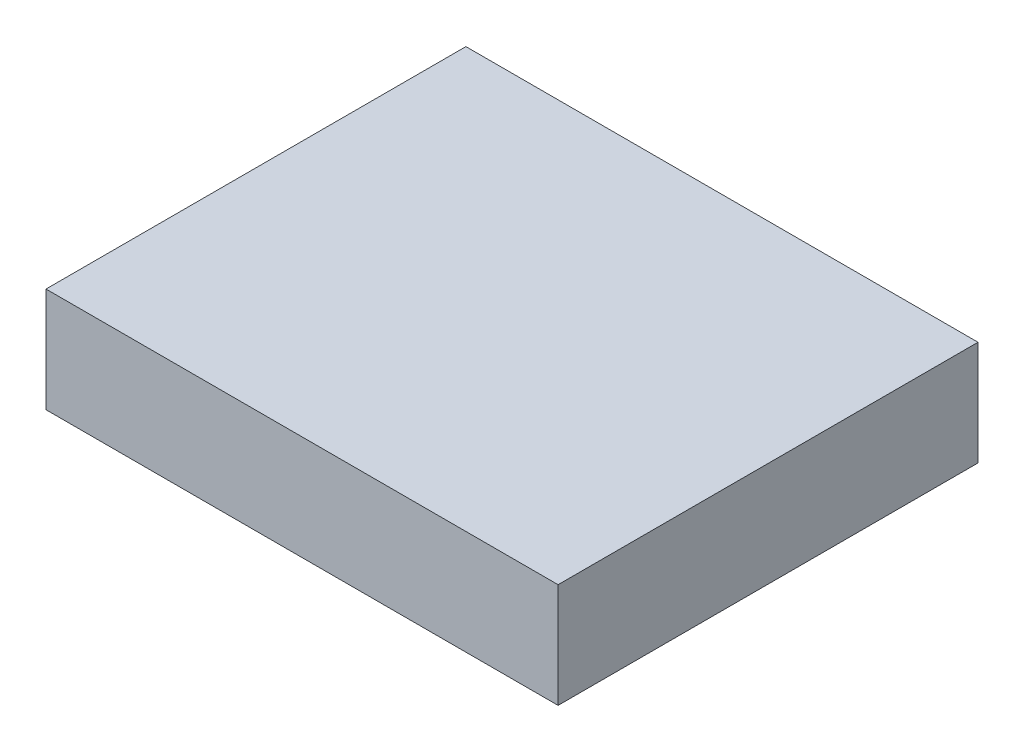
ISO-10303-21;
HEADER;
FILE_DESCRIPTION(('STEP AP214'),'2;1');
FILE_NAME('part.step','',(''),(''),'','','');
FILE_SCHEMA(('AUTOMOTIVE_DESIGN { 1 0 10303 214 1 1 1 1 }'));
ENDSEC;
DATA;
#1=APPLICATION_CONTEXT('core data for automotive mechanical design processes');
#2=APPLICATION_PROTOCOL_DEFINITION('international standard','automotive_design',2000,#1);
#3=PRODUCT_CONTEXT('',#1,'mechanical');
#4=PRODUCT('Part','Part','',(#3));
#5=PRODUCT_RELATED_PRODUCT_CATEGORY('part','',(#4));
#6=PRODUCT_DEFINITION_FORMATION('','',#4);
#7=PRODUCT_DEFINITION_CONTEXT('part definition',#1,'design');
#8=PRODUCT_DEFINITION('design','',#6,#7);
#9=PRODUCT_DEFINITION_SHAPE('','',#8);
#10=(LENGTH_UNIT() NAMED_UNIT(*) SI_UNIT(.MILLI.,.METRE.));
#11=(NAMED_UNIT(*) PLANE_ANGLE_UNIT() SI_UNIT($,.RADIAN.));
#12=(NAMED_UNIT(*) SI_UNIT($,.STERADIAN.) SOLID_ANGLE_UNIT());
#13=UNCERTAINTY_MEASURE_WITH_UNIT(LENGTH_MEASURE(1.E-05),#10,'distance_accuracy_value','');
#14=(GEOMETRIC_REPRESENTATION_CONTEXT(3) GLOBAL_UNCERTAINTY_ASSIGNED_CONTEXT((#13)) GLOBAL_UNIT_ASSIGNED_CONTEXT((#10,
#11,#12)) REPRESENTATION_CONTEXT('',''));
#15=CARTESIAN_POINT('',(0.,0.,0.));
#16=DIRECTION('',(0.,0.,1.));
#17=DIRECTION('',(1.,0.,0.));
#18=AXIS2_PLACEMENT_3D('',#15,#16,#17);
#19=CARTESIAN_POINT('',(0.,2.45,0.));
#20=DIRECTION('',(1.,0.,0.));
#21=DIRECTION('',(0.,0.,-1.));
#22=AXIS2_PLACEMENT_3D('',#19,#20,#21);
#23=PLANE('',#22);
#24=DIRECTION('',(0.,0.,1.));
#25=VECTOR('',#24,1.);
#26=CARTESIAN_POINT('',(0.,0.,0.));
#27=LINE('',#26,#25);
#28=CARTESIAN_POINT('',(0.,0.,-9.84));
#29=VERTEX_POINT('',#28);
#30=CARTESIAN_POINT('',(0.,0.,0.));
#31=VERTEX_POINT('',#30);
#32=EDGE_CURVE('E102',#29,#31,#27,.T.);
#33=ORIENTED_EDGE('',*,*,#32,.T.);
#34=DIRECTION('',(0.,-1.,0.));
#35=VECTOR('',#34,1.);
#36=CARTESIAN_POINT('',(0.,2.45,0.));
#37=LINE('',#36,#35);
#38=CARTESIAN_POINT('',(0.,2.45,0.));
#39=VERTEX_POINT('',#38);
#40=EDGE_CURVE('E11',#39,#31,#37,.T.);
#41=ORIENTED_EDGE('',*,*,#40,.F.);
#42=DIRECTION('',(0.,0.,1.));
#43=VECTOR('',#42,1.);
#44=CARTESIAN_POINT('',(0.,2.45,0.));
#45=LINE('',#44,#43);
#46=CARTESIAN_POINT('',(0.,2.45,-9.84));
#47=VERTEX_POINT('',#46);
#48=EDGE_CURVE('E90',#47,#39,#45,.T.);
#49=ORIENTED_EDGE('',*,*,#48,.F.);
#50=DIRECTION('',(0.,-1.,0.));
#51=VECTOR('',#50,1.);
#52=CARTESIAN_POINT('',(0.,2.45,-9.84));
#53=LINE('',#52,#51);
#54=EDGE_CURVE('E98',#47,#29,#53,.T.);
#55=ORIENTED_EDGE('',*,*,#54,.T.);
#56=EDGE_LOOP('',(#33,#41,#49,#55));
#57=FACE_BOUND('',#56,.T.);
#58=ADVANCED_FACE('F39',(#57),#23,.F.);
#59=CARTESIAN_POINT('',(0.,2.45,0.));
#60=DIRECTION('',(0.,0.,-1.));
#61=DIRECTION('',(-1.,0.,0.));
#62=AXIS2_PLACEMENT_3D('',#59,#60,#61);
#63=PLANE('',#62);
#64=DIRECTION('',(1.,0.,0.));
#65=VECTOR('',#64,1.);
#66=CARTESIAN_POINT('',(0.,0.,0.));
#67=LINE('',#66,#65);
#68=CARTESIAN_POINT('',(12.,0.,0.));
#69=VERTEX_POINT('',#68);
#70=EDGE_CURVE('E94',#31,#69,#67,.T.);
#71=ORIENTED_EDGE('',*,*,#70,.T.);
#72=DIRECTION('',(0.,-1.,0.));
#73=VECTOR('',#72,1.);
#74=CARTESIAN_POINT('',(12.,2.45,0.));
#75=LINE('',#74,#73);
#76=CARTESIAN_POINT('',(12.,2.45,0.));
#77=VERTEX_POINT('',#76);
#78=EDGE_CURVE('E47',#77,#69,#75,.T.);
#79=ORIENTED_EDGE('',*,*,#78,.F.);
#80=DIRECTION('',(1.,0.,0.));
#81=VECTOR('',#80,1.);
#82=CARTESIAN_POINT('',(0.,2.45,0.));
#83=LINE('',#82,#81);
#84=EDGE_CURVE('E85',#39,#77,#83,.T.);
#85=ORIENTED_EDGE('',*,*,#84,.F.);
#86=ORIENTED_EDGE('',*,*,#40,.T.);
#87=EDGE_LOOP('',(#71,#79,#85,#86));
#88=FACE_BOUND('',#87,.T.);
#89=ADVANCED_FACE('F93',(#88),#63,.F.);
#90=CARTESIAN_POINT('',(12.,2.45,0.));
#91=DIRECTION('',(-1.,0.,0.));
#92=DIRECTION('',(0.,0.,1.));
#93=AXIS2_PLACEMENT_3D('',#90,#91,#92);
#94=PLANE('',#93);
#95=DIRECTION('',(0.,0.,-1.));
#96=VECTOR('',#95,1.);
#97=CARTESIAN_POINT('',(12.,0.,0.));
#98=LINE('',#97,#96);
#99=CARTESIAN_POINT('',(12.,0.,-9.84));
#100=VERTEX_POINT('',#99);
#101=EDGE_CURVE('E72',#69,#100,#98,.T.);
#102=ORIENTED_EDGE('',*,*,#101,.T.);
#103=DIRECTION('',(0.,-1.,0.));
#104=VECTOR('',#103,1.);
#105=CARTESIAN_POINT('',(12.,2.45,-9.84));
#106=LINE('',#105,#104);
#107=CARTESIAN_POINT('',(12.,2.45,-9.84));
#108=VERTEX_POINT('',#107);
#109=EDGE_CURVE('E95',#108,#100,#106,.T.);
#110=ORIENTED_EDGE('',*,*,#109,.F.);
#111=DIRECTION('',(0.,0.,-1.));
#112=VECTOR('',#111,1.);
#113=CARTESIAN_POINT('',(12.,2.45,0.));
#114=LINE('',#113,#112);
#115=EDGE_CURVE('E88',#77,#108,#114,.T.);
#116=ORIENTED_EDGE('',*,*,#115,.F.);
#117=ORIENTED_EDGE('',*,*,#78,.T.);
#118=EDGE_LOOP('',(#102,#110,#116,#117));
#119=FACE_BOUND('',#118,.T.);
#120=ADVANCED_FACE('F96',(#119),#94,.F.);
#121=CARTESIAN_POINT('',(0.,2.45,-9.84));
#122=DIRECTION('',(0.,0.,1.));
#123=DIRECTION('',(1.,0.,0.));
#124=AXIS2_PLACEMENT_3D('',#121,#122,#123);
#125=PLANE('',#124);
#126=DIRECTION('',(-1.,0.,0.));
#127=VECTOR('',#126,1.);
#128=CARTESIAN_POINT('',(0.,0.,-9.84));
#129=LINE('',#128,#127);
#130=EDGE_CURVE('E78',#100,#29,#129,.T.);
#131=ORIENTED_EDGE('',*,*,#130,.T.);
#132=ORIENTED_EDGE('',*,*,#54,.F.);
#133=DIRECTION('',(-1.,0.,0.));
#134=VECTOR('',#133,1.);
#135=CARTESIAN_POINT('',(0.,2.45,-9.84));
#136=LINE('',#135,#134);
#137=EDGE_CURVE('E55',#108,#47,#136,.T.);
#138=ORIENTED_EDGE('',*,*,#137,.F.);
#139=ORIENTED_EDGE('',*,*,#109,.T.);
#140=EDGE_LOOP('',(#131,#132,#138,#139));
#141=FACE_BOUND('',#140,.T.);
#142=ADVANCED_FACE('F109',(#141),#125,.F.);
#143=CARTESIAN_POINT('',(0.,2.45,0.));
#144=DIRECTION('',(0.,-1.,0.));
#145=DIRECTION('',(0.,0.,-1.));
#146=AXIS2_PLACEMENT_3D('',#143,#144,#145);
#147=PLANE('',#146);
#148=ORIENTED_EDGE('',*,*,#48,.T.);
#149=ORIENTED_EDGE('',*,*,#84,.T.);
#150=ORIENTED_EDGE('',*,*,#115,.T.);
#151=ORIENTED_EDGE('',*,*,#137,.T.);
#152=EDGE_LOOP('',(#148,#149,#150,#151));
#153=FACE_BOUND('',#152,.T.);
#154=ADVANCED_FACE('F86',(#153),#147,.F.);
#155=CARTESIAN_POINT('',(0.,0.,0.));
#156=DIRECTION('',(0.,-1.,0.));
#157=DIRECTION('',(0.,0.,-1.));
#158=AXIS2_PLACEMENT_3D('',#155,#156,#157);
#159=PLANE('',#158);
#160=ORIENTED_EDGE('',*,*,#32,.F.);
#161=ORIENTED_EDGE('',*,*,#130,.F.);
#162=ORIENTED_EDGE('',*,*,#101,.F.);
#163=ORIENTED_EDGE('',*,*,#70,.F.);
#164=EDGE_LOOP('',(#160,#161,#162,#163));
#165=FACE_BOUND('',#164,.T.);
#166=ADVANCED_FACE('F112',(#165),#159,.T.);
#167=CLOSED_SHELL('',(#58,#89,#120,#142,#154,#166));
#168=MANIFOLD_SOLID_BREP('B2',#167);
#169=ADVANCED_BREP_SHAPE_REPRESENTATION('',(#18,#168),#14);
#170=SHAPE_DEFINITION_REPRESENTATION(#9,#169);
ENDSEC;
END-ISO-10303-21;
